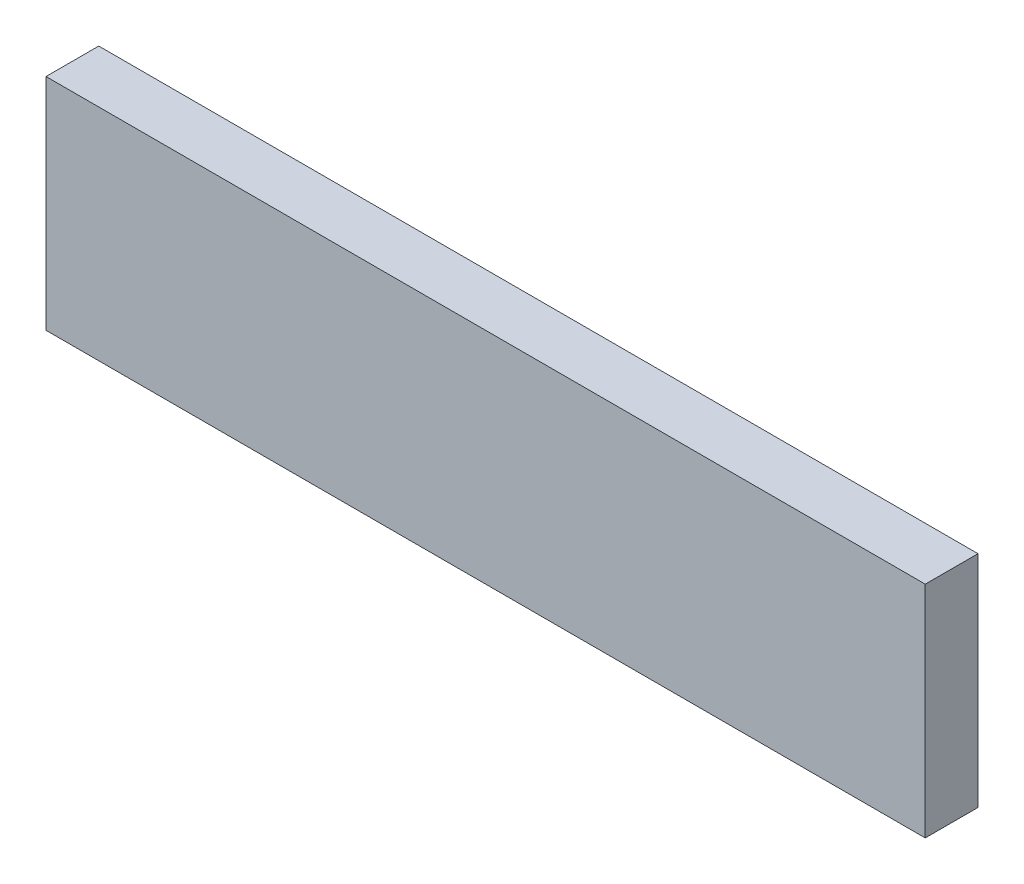
ISO-10303-21;
HEADER;
FILE_DESCRIPTION(('STEP AP214'),'2;1');
FILE_NAME('part.step','',(''),(''),'','','');
FILE_SCHEMA(('AUTOMOTIVE_DESIGN { 1 0 10303 214 1 1 1 1 }'));
ENDSEC;
DATA;
#1=APPLICATION_CONTEXT('core data for automotive mechanical design processes');
#2=APPLICATION_PROTOCOL_DEFINITION('international standard','automotive_design',2000,#1);
#3=PRODUCT_CONTEXT('',#1,'mechanical');
#4=PRODUCT('Part','Part','',(#3));
#5=PRODUCT_RELATED_PRODUCT_CATEGORY('part','',(#4));
#6=PRODUCT_DEFINITION_FORMATION('','',#4);
#7=PRODUCT_DEFINITION_CONTEXT('part definition',#1,'design');
#8=PRODUCT_DEFINITION('design','',#6,#7);
#9=PRODUCT_DEFINITION_SHAPE('','',#8);
#10=(LENGTH_UNIT() NAMED_UNIT(*) SI_UNIT(.MILLI.,.METRE.));
#11=(NAMED_UNIT(*) PLANE_ANGLE_UNIT() SI_UNIT($,.RADIAN.));
#12=(NAMED_UNIT(*) SI_UNIT($,.STERADIAN.) SOLID_ANGLE_UNIT());
#13=UNCERTAINTY_MEASURE_WITH_UNIT(LENGTH_MEASURE(1.E-05),#10,'distance_accuracy_value','');
#14=(GEOMETRIC_REPRESENTATION_CONTEXT(3) GLOBAL_UNCERTAINTY_ASSIGNED_CONTEXT((#13)) GLOBAL_UNIT_ASSIGNED_CONTEXT((#10,
#11,#12)) REPRESENTATION_CONTEXT('',''));
#15=CARTESIAN_POINT('',(0.,0.,0.));
#16=DIRECTION('',(0.,0.,1.));
#17=DIRECTION('',(1.,0.,0.));
#18=AXIS2_PLACEMENT_3D('',#15,#16,#17);
#19=CARTESIAN_POINT('',(-142.857142857143,43.0194805194805,6.));
#20=DIRECTION('',(1.,0.,0.));
#21=DIRECTION('',(0.,0.,-1.));
#22=AXIS2_PLACEMENT_3D('',#19,#20,#21);
#23=PLANE('',#22);
#24=DIRECTION('',(0.,-1.,0.));
#25=VECTOR('',#24,1.);
#26=CARTESIAN_POINT('',(-142.857142857143,43.0194805194805,0.));
#27=LINE('',#26,#25);
#28=CARTESIAN_POINT('',(-142.857142857143,43.0194805194805,0.));
#29=VERTEX_POINT('',#28);
#30=CARTESIAN_POINT('',(-142.857142857143,18.0194805194805,0.));
#31=VERTEX_POINT('',#30);
#32=EDGE_CURVE('E107',#29,#31,#27,.T.);
#33=ORIENTED_EDGE('',*,*,#32,.T.);
#34=DIRECTION('',(0.,0.,-1.));
#35=VECTOR('',#34,1.);
#36=CARTESIAN_POINT('',(-142.857142857143,18.0194805194805,6.));
#37=LINE('',#36,#35);
#38=CARTESIAN_POINT('',(-142.857142857143,18.0194805194805,6.));
#39=VERTEX_POINT('',#38);
#40=EDGE_CURVE('E11',#39,#31,#37,.T.);
#41=ORIENTED_EDGE('',*,*,#40,.F.);
#42=DIRECTION('',(0.,-1.,0.));
#43=VECTOR('',#42,1.);
#44=CARTESIAN_POINT('',(-142.857142857143,43.0194805194805,6.));
#45=LINE('',#44,#43);
#46=CARTESIAN_POINT('',(-142.857142857143,43.0194805194805,6.));
#47=VERTEX_POINT('',#46);
#48=EDGE_CURVE('E91',#47,#39,#45,.T.);
#49=ORIENTED_EDGE('',*,*,#48,.F.);
#50=DIRECTION('',(0.,0.,-1.));
#51=VECTOR('',#50,1.);
#52=CARTESIAN_POINT('',(-142.857142857143,43.0194805194805,6.));
#53=LINE('',#52,#51);
#54=EDGE_CURVE('E103',#47,#29,#53,.T.);
#55=ORIENTED_EDGE('',*,*,#54,.T.);
#56=EDGE_LOOP('',(#33,#41,#49,#55));
#57=FACE_BOUND('',#56,.T.);
#58=ADVANCED_FACE('F39',(#57),#23,.F.);
#59=CARTESIAN_POINT('',(-142.857142857143,18.0194805194805,6.));
#60=DIRECTION('',(0.,1.,0.));
#61=DIRECTION('',(-1.,0.,0.));
#62=AXIS2_PLACEMENT_3D('',#59,#60,#61);
#63=PLANE('',#62);
#64=DIRECTION('',(1.,0.,0.));
#65=VECTOR('',#64,1.);
#66=CARTESIAN_POINT('',(-142.857142857143,18.0194805194805,0.));
#67=LINE('',#66,#65);
#68=CARTESIAN_POINT('',(-42.8571428571429,18.0194805194805,0.));
#69=VERTEX_POINT('',#68);
#70=EDGE_CURVE('E96',#31,#69,#67,.T.);
#71=ORIENTED_EDGE('',*,*,#70,.T.);
#72=DIRECTION('',(0.,0.,-1.));
#73=VECTOR('',#72,1.);
#74=CARTESIAN_POINT('',(-42.8571428571429,18.0194805194805,6.));
#75=LINE('',#74,#73);
#76=CARTESIAN_POINT('',(-42.8571428571429,18.0194805194805,6.));
#77=VERTEX_POINT('',#76);
#78=EDGE_CURVE('E48',#77,#69,#75,.T.);
#79=ORIENTED_EDGE('',*,*,#78,.F.);
#80=DIRECTION('',(1.,0.,0.));
#81=VECTOR('',#80,1.);
#82=CARTESIAN_POINT('',(-142.857142857143,18.0194805194805,6.));
#83=LINE('',#82,#81);
#84=EDGE_CURVE('E86',#39,#77,#83,.T.);
#85=ORIENTED_EDGE('',*,*,#84,.F.);
#86=ORIENTED_EDGE('',*,*,#40,.T.);
#87=EDGE_LOOP('',(#71,#79,#85,#86));
#88=FACE_BOUND('',#87,.T.);
#89=ADVANCED_FACE('F95',(#88),#63,.F.);
#90=CARTESIAN_POINT('',(-42.8571428571429,43.0194805194805,6.));
#91=DIRECTION('',(-1.,0.,0.));
#92=DIRECTION('',(0.,0.,1.));
#93=AXIS2_PLACEMENT_3D('',#90,#91,#92);
#94=PLANE('',#93);
#95=DIRECTION('',(0.,1.,0.));
#96=VECTOR('',#95,1.);
#97=CARTESIAN_POINT('',(-42.8571428571429,43.0194805194805,0.));
#98=LINE('',#97,#96);
#99=CARTESIAN_POINT('',(-42.8571428571429,43.0194805194805,0.));
#100=VERTEX_POINT('',#99);
#101=EDGE_CURVE('E73',#69,#100,#98,.T.);
#102=ORIENTED_EDGE('',*,*,#101,.T.);
#103=DIRECTION('',(0.,0.,-1.));
#104=VECTOR('',#103,1.);
#105=CARTESIAN_POINT('',(-42.8571428571429,43.0194805194805,6.));
#106=LINE('',#105,#104);
#107=CARTESIAN_POINT('',(-42.8571428571429,43.0194805194805,6.));
#108=VERTEX_POINT('',#107);
#109=EDGE_CURVE('E98',#108,#100,#106,.T.);
#110=ORIENTED_EDGE('',*,*,#109,.F.);
#111=DIRECTION('',(0.,1.,0.));
#112=VECTOR('',#111,1.);
#113=CARTESIAN_POINT('',(-42.8571428571429,43.0194805194805,6.));
#114=LINE('',#113,#112);
#115=EDGE_CURVE('E89',#77,#108,#114,.T.);
#116=ORIENTED_EDGE('',*,*,#115,.F.);
#117=ORIENTED_EDGE('',*,*,#78,.T.);
#118=EDGE_LOOP('',(#102,#110,#116,#117));
#119=FACE_BOUND('',#118,.T.);
#120=ADVANCED_FACE('F99',(#119),#94,.F.);
#121=CARTESIAN_POINT('',(-142.857142857143,43.0194805194805,6.));
#122=DIRECTION('',(0.,-1.,0.));
#123=DIRECTION('',(0.,0.,-1.));
#124=AXIS2_PLACEMENT_3D('',#121,#122,#123);
#125=PLANE('',#124);
#126=DIRECTION('',(-1.,0.,0.));
#127=VECTOR('',#126,1.);
#128=CARTESIAN_POINT('',(-142.857142857143,43.0194805194805,0.));
#129=LINE('',#128,#127);
#130=EDGE_CURVE('E79',#100,#29,#129,.T.);
#131=ORIENTED_EDGE('',*,*,#130,.T.);
#132=ORIENTED_EDGE('',*,*,#54,.F.);
#133=DIRECTION('',(-1.,0.,0.));
#134=VECTOR('',#133,1.);
#135=CARTESIAN_POINT('',(-142.857142857143,43.0194805194805,6.));
#136=LINE('',#135,#134);
#137=EDGE_CURVE('E56',#108,#47,#136,.T.);
#138=ORIENTED_EDGE('',*,*,#137,.F.);
#139=ORIENTED_EDGE('',*,*,#109,.T.);
#140=EDGE_LOOP('',(#131,#132,#138,#139));
#141=FACE_BOUND('',#140,.T.);
#142=ADVANCED_FACE('F120',(#141),#125,.F.);
#143=CARTESIAN_POINT('',(0.,0.,6.));
#144=DIRECTION('',(0.,0.,1.));
#145=DIRECTION('',(1.,0.,0.));
#146=AXIS2_PLACEMENT_3D('',#143,#144,#145);
#147=PLANE('',#146);
#148=ORIENTED_EDGE('',*,*,#48,.T.);
#149=ORIENTED_EDGE('',*,*,#84,.T.);
#150=ORIENTED_EDGE('',*,*,#115,.T.);
#151=ORIENTED_EDGE('',*,*,#137,.T.);
#152=EDGE_LOOP('',(#148,#149,#150,#151));
#153=FACE_BOUND('',#152,.T.);
#154=ADVANCED_FACE('F87',(#153),#147,.T.);
#155=CARTESIAN_POINT('',(0.,0.,0.));
#156=DIRECTION('',(0.,0.,1.));
#157=DIRECTION('',(1.,0.,0.));
#158=AXIS2_PLACEMENT_3D('',#155,#156,#157);
#159=PLANE('',#158);
#160=ORIENTED_EDGE('',*,*,#32,.F.);
#161=ORIENTED_EDGE('',*,*,#130,.F.);
#162=ORIENTED_EDGE('',*,*,#101,.F.);
#163=ORIENTED_EDGE('',*,*,#70,.F.);
#164=EDGE_LOOP('',(#160,#161,#162,#163));
#165=FACE_BOUND('',#164,.T.);
#166=ADVANCED_FACE('F123',(#165),#159,.F.);
#167=CLOSED_SHELL('',(#58,#89,#120,#142,#154,#166));
#168=MANIFOLD_SOLID_BREP('B2',#167);
#169=ADVANCED_BREP_SHAPE_REPRESENTATION('',(#18,#168),#14);
#170=SHAPE_DEFINITION_REPRESENTATION(#9,#169);
ENDSEC;
END-ISO-10303-21;
